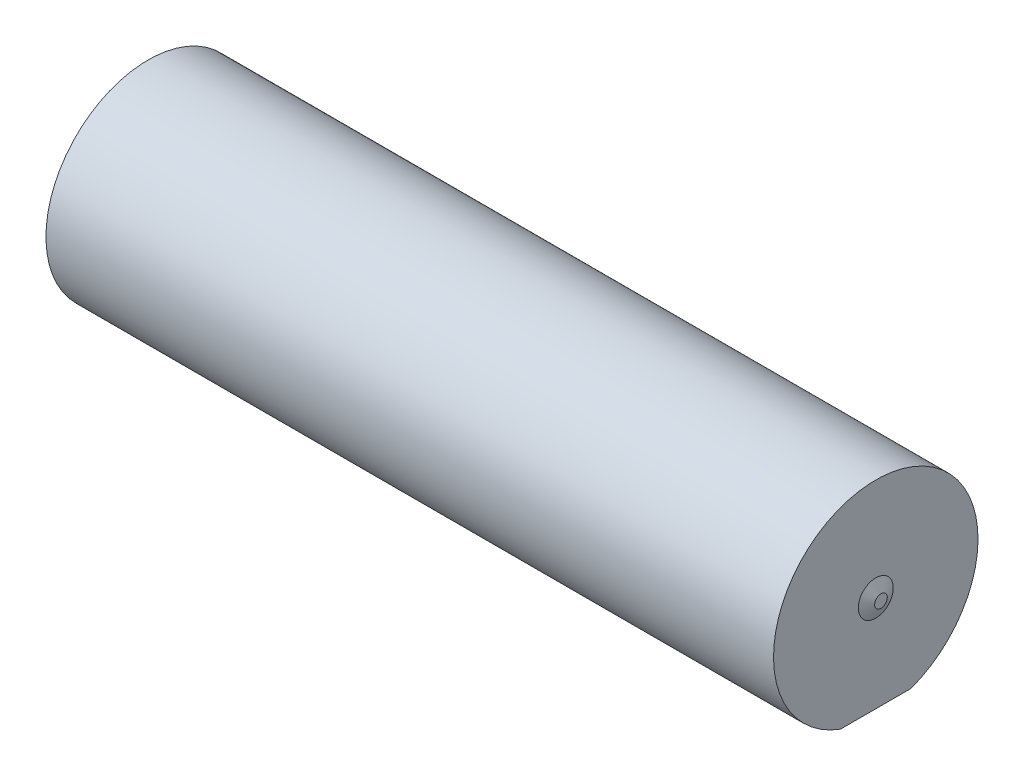
ISO-10303-21;
HEADER;
FILE_DESCRIPTION(('STEP AP214'),'2;1');
FILE_NAME('part.step','',(''),(''),'','','');
FILE_SCHEMA(('AUTOMOTIVE_DESIGN { 1 0 10303 214 1 1 1 1 }'));
ENDSEC;
DATA;
#1=APPLICATION_CONTEXT('core data for automotive mechanical design processes');
#2=APPLICATION_PROTOCOL_DEFINITION('international standard','automotive_design',2000,#1);
#3=PRODUCT_CONTEXT('',#1,'mechanical');
#4=PRODUCT('Part','Part','',(#3));
#5=PRODUCT_RELATED_PRODUCT_CATEGORY('part','',(#4));
#6=PRODUCT_DEFINITION_FORMATION('','',#4);
#7=PRODUCT_DEFINITION_CONTEXT('part definition',#1,'design');
#8=PRODUCT_DEFINITION('design','',#6,#7);
#9=PRODUCT_DEFINITION_SHAPE('','',#8);
#10=(LENGTH_UNIT() NAMED_UNIT(*) SI_UNIT(.MILLI.,.METRE.));
#11=(NAMED_UNIT(*) PLANE_ANGLE_UNIT() SI_UNIT($,.RADIAN.));
#12=(NAMED_UNIT(*) SI_UNIT($,.STERADIAN.) SOLID_ANGLE_UNIT());
#13=UNCERTAINTY_MEASURE_WITH_UNIT(LENGTH_MEASURE(1.E-05),#10,'distance_accuracy_value','');
#14=(GEOMETRIC_REPRESENTATION_CONTEXT(3) GLOBAL_UNCERTAINTY_ASSIGNED_CONTEXT((#13)) GLOBAL_UNIT_ASSIGNED_CONTEXT((#10,
#11,#12)) REPRESENTATION_CONTEXT('',''));
#15=CARTESIAN_POINT('',(0.,0.,0.));
#16=DIRECTION('',(0.,0.,1.));
#17=DIRECTION('',(1.,0.,0.));
#18=AXIS2_PLACEMENT_3D('',#15,#16,#17);
#19=CARTESIAN_POINT('',(0.,0.,0.));
#20=DIRECTION('',(-1.,0.,0.));
#21=DIRECTION('',(0.,-1.,0.));
#22=AXIS2_PLACEMENT_3D('',#19,#20,#21);
#23=CYLINDRICAL_SURFACE('',#22,196.645479285607);
#24=CARTESIAN_POINT('',(0.,0.,0.));
#25=DIRECTION('',(-1.,0.,0.));
#26=DIRECTION('',(0.,-1.,0.));
#27=AXIS2_PLACEMENT_3D('',#24,#25,#26);
#28=CIRCLE('',#27,196.645479285607);
#29=CARTESIAN_POINT('',(0.,-196.645479285607,0.));
#30=VERTEX_POINT('',#29);
#31=EDGE_CURVE('E123',#30,#30,#28,.T.);
#32=ORIENTED_EDGE('',*,*,#31,.F.);
#33=EDGE_LOOP('',(#32));
#34=FACE_BOUND('',#33,.T.);
#35=DIRECTION('',(-1.,0.,0.));
#36=VECTOR('',#35,1.);
#37=CARTESIAN_POINT('',(0.,-184.594850552424,67.7804224905273));
#38=LINE('',#37,#36);
#39=CARTESIAN_POINT('',(1399.31947366069,-184.594850552424,67.7804224905269));
#40=VERTEX_POINT('',#39);
#41=CARTESIAN_POINT('',(1000.,-184.594850552424,67.7804224905271));
#42=VERTEX_POINT('',#41);
#43=EDGE_CURVE('E93',#40,#42,#38,.T.);
#44=ORIENTED_EDGE('',*,*,#43,.F.);
#45=CARTESIAN_POINT('',(1399.31947366069,1.13312312440551E-13,0.));
#46=DIRECTION('',(-1.,0.,0.));
#47=DIRECTION('',(0.,-1.,0.));
#48=AXIS2_PLACEMENT_3D('',#45,#46,#47);
#49=CIRCLE('',#48,196.645479285607);
#50=CARTESIAN_POINT('',(1399.31947366069,-184.594850552424,-67.7804224905269));
#51=VERTEX_POINT('',#50);
#52=EDGE_CURVE('E92',#40,#51,#49,.T.);
#53=ORIENTED_EDGE('',*,*,#52,.T.);
#54=DIRECTION('',(-1.,0.,0.));
#55=VECTOR('',#54,1.);
#56=CARTESIAN_POINT('',(0.,-184.594850552424,-67.7804224905273));
#57=LINE('',#56,#55);
#58=CARTESIAN_POINT('',(1000.,-184.594850552424,-67.7804224905271));
#59=VERTEX_POINT('',#58);
#60=EDGE_CURVE('E85',#59,#51,#57,.F.);
#61=ORIENTED_EDGE('',*,*,#60,.F.);
#62=CARTESIAN_POINT('',(1000.,0.,0.));
#63=DIRECTION('',(-1.,0.,0.));
#64=DIRECTION('',(0.,0.,1.));
#65=AXIS2_PLACEMENT_3D('',#62,#63,#64);
#66=CIRCLE('',#65,196.645479285607);
#67=EDGE_CURVE('E43',#59,#42,#66,.T.);
#68=ORIENTED_EDGE('',*,*,#67,.T.);
#69=EDGE_LOOP('',(#44,#53,#61,#68));
#70=FACE_BOUND('',#69,.T.);
#71=ADVANCED_FACE('F35',(#34,#70),#23,.T.);
#72=CARTESIAN_POINT('',(1399.31947366069,196.645479285607,0.));
#73=DIRECTION('',(-1.,0.,0.));
#74=DIRECTION('',(0.,-1.,0.));
#75=AXIS2_PLACEMENT_3D('',#72,#73,#74);
#76=PLANE('',#75);
#77=CARTESIAN_POINT('',(1399.31947366069,1.13312312440551E-13,0.));
#78=DIRECTION('',(-1.,0.,0.));
#79=DIRECTION('',(0.,-1.,0.));
#80=AXIS2_PLACEMENT_3D('',#77,#78,#79);
#81=CIRCLE('',#80,33.57963809691);
#82=CARTESIAN_POINT('',(1399.31947366069,-33.5796380969099,0.));
#83=VERTEX_POINT('',#82);
#84=EDGE_CURVE('E83',#83,#83,#81,.F.);
#85=ORIENTED_EDGE('',*,*,#84,.F.);
#86=EDGE_LOOP('',(#85));
#87=FACE_BOUND('',#86,.T.);
#88=DIRECTION('',(0.,0.,1.));
#89=VECTOR('',#88,1.);
#90=CARTESIAN_POINT('',(1399.31947366069,-184.594850552424,0.));
#91=LINE('',#90,#89);
#92=EDGE_CURVE('E56',#51,#40,#91,.T.);
#93=ORIENTED_EDGE('',*,*,#92,.F.);
#94=ORIENTED_EDGE('',*,*,#52,.F.);
#95=EDGE_LOOP('',(#93,#94));
#96=FACE_BOUND('',#95,.T.);
#97=ADVANCED_FACE('F135',(#87,#96),#76,.F.);
#98=CARTESIAN_POINT('',(0.,0.,0.));
#99=DIRECTION('',(-1.,0.,0.));
#100=DIRECTION('',(0.,-1.,0.));
#101=AXIS2_PLACEMENT_3D('',#98,#99,#100);
#102=CYLINDRICAL_SURFACE('',#101,186.645479285607);
#103=CARTESIAN_POINT('',(0.,0.,0.));
#104=DIRECTION('',(1.,0.,0.));
#105=DIRECTION('',(0.,1.,0.));
#106=AXIS2_PLACEMENT_3D('',#103,#104,#105);
#107=CIRCLE('',#106,186.645479285607);
#108=CARTESIAN_POINT('',(0.,186.645479285607,0.));
#109=VERTEX_POINT('',#108);
#110=EDGE_CURVE('E116',#109,#109,#107,.F.);
#111=ORIENTED_EDGE('',*,*,#110,.T.);
#112=EDGE_LOOP('',(#111));
#113=FACE_BOUND('',#112,.T.);
#114=CARTESIAN_POINT('',(1389.31947366069,1.12502545160288E-13,0.));
#115=DIRECTION('',(-1.,0.,0.));
#116=DIRECTION('',(0.,-1.,0.));
#117=AXIS2_PLACEMENT_3D('',#114,#115,#116);
#118=CIRCLE('',#117,186.645479285607);
#119=CARTESIAN_POINT('',(1389.31947366069,-184.594850552424,27.5912320725656));
#120=VERTEX_POINT('',#119);
#121=CARTESIAN_POINT('',(1389.31947366069,-184.594850552424,-27.5912320725656));
#122=VERTEX_POINT('',#121);
#123=EDGE_CURVE('E105',#120,#122,#118,.T.);
#124=ORIENTED_EDGE('',*,*,#123,.F.);
#125=DIRECTION('',(-1.,0.,0.));
#126=VECTOR('',#125,1.);
#127=CARTESIAN_POINT('',(0.,-184.594850552424,27.5912320725667));
#128=LINE('',#127,#126);
#129=CARTESIAN_POINT('',(1000.,-184.594850552424,27.5912320725662));
#130=VERTEX_POINT('',#129);
#131=EDGE_CURVE('E50',#120,#130,#128,.T.);
#132=ORIENTED_EDGE('',*,*,#131,.T.);
#133=CARTESIAN_POINT('',(1000.,0.,0.));
#134=DIRECTION('',(1.,0.,0.));
#135=DIRECTION('',(0.,0.,-1.));
#136=AXIS2_PLACEMENT_3D('',#133,#134,#135);
#137=CIRCLE('',#136,186.645479285607);
#138=CARTESIAN_POINT('',(1000.,-184.594850552424,-27.5912320725662));
#139=VERTEX_POINT('',#138);
#140=EDGE_CURVE('E88',#130,#139,#137,.T.);
#141=ORIENTED_EDGE('',*,*,#140,.T.);
#142=DIRECTION('',(-1.,0.,0.));
#143=VECTOR('',#142,1.);
#144=CARTESIAN_POINT('',(0.,-184.594850552424,-27.5912320725667));
#145=LINE('',#144,#143);
#146=EDGE_CURVE('E87',#139,#122,#145,.F.);
#147=ORIENTED_EDGE('',*,*,#146,.T.);
#148=EDGE_LOOP('',(#124,#132,#141,#147));
#149=FACE_BOUND('',#148,.T.);
#150=ADVANCED_FACE('F138',(#113,#149),#102,.F.);
#151=CARTESIAN_POINT('',(1389.31947366069,26.0597886929293,0.));
#152=DIRECTION('',(-1.,0.,0.));
#153=DIRECTION('',(0.,-1.,0.));
#154=AXIS2_PLACEMENT_3D('',#151,#152,#153);
#155=PLANE('',#154);
#156=CARTESIAN_POINT('',(1389.31947366069,1.12502545160288E-13,0.));
#157=DIRECTION('',(-1.,0.,0.));
#158=DIRECTION('',(0.,-1.,0.));
#159=AXIS2_PLACEMENT_3D('',#156,#157,#158);
#160=CIRCLE('',#159,26.0597886929292);
#161=CARTESIAN_POINT('',(1389.31947366069,-26.0597886929291,0.));
#162=VERTEX_POINT('',#161);
#163=EDGE_CURVE('E108',#162,#162,#160,.T.);
#164=ORIENTED_EDGE('',*,*,#163,.F.);
#165=EDGE_LOOP('',(#164));
#166=FACE_BOUND('',#165,.T.);
#167=ORIENTED_EDGE('',*,*,#123,.T.);
#168=DIRECTION('',(0.,0.,1.));
#169=VECTOR('',#168,1.);
#170=CARTESIAN_POINT('',(1389.31947366069,-184.594850552424,0.));
#171=LINE('',#170,#169);
#172=EDGE_CURVE('E11',#122,#120,#171,.T.);
#173=ORIENTED_EDGE('',*,*,#172,.T.);
#174=EDGE_LOOP('',(#167,#173));
#175=FACE_BOUND('',#174,.T.);
#176=ADVANCED_FACE('F144',(#166,#175),#155,.T.);
#177=CARTESIAN_POINT('',(0.,160.,0.));
#178=DIRECTION('',(1.,0.,0.));
#179=DIRECTION('',(0.,1.,0.));
#180=AXIS2_PLACEMENT_3D('',#177,#178,#179);
#181=PLANE('',#180);
#182=ORIENTED_EDGE('',*,*,#31,.T.);
#183=EDGE_LOOP('',(#182));
#184=FACE_BOUND('',#183,.T.);
#185=ORIENTED_EDGE('',*,*,#110,.F.);
#186=EDGE_LOOP('',(#185));
#187=FACE_BOUND('',#186,.T.);
#188=ADVANCED_FACE('F37',(#184,#187),#181,.F.);
#189=CARTESIAN_POINT('',(0.,0.,0.));
#190=DIRECTION('',(-1.,0.,0.));
#191=DIRECTION('',(0.,-1.,0.));
#192=AXIS2_PLACEMENT_3D('',#189,#190,#191);
#193=CIRCLE('',#192,160.);
#194=CARTESIAN_POINT('',(0.,-160.,0.));
#195=VERTEX_POINT('',#194);
#196=EDGE_CURVE('E112',#195,#195,#193,.T.);
#197=ORIENTED_EDGE('',*,*,#196,.F.);
#198=EDGE_LOOP('',(#197));
#199=FACE_BOUND('',#198,.T.);
#200=CARTESIAN_POINT('',(0.,0.,0.));
#201=DIRECTION('',(1.,0.,0.));
#202=DIRECTION('',(0.,1.,0.));
#203=AXIS2_PLACEMENT_3D('',#200,#201,#202);
#204=CIRCLE('',#203,170.);
#205=CARTESIAN_POINT('',(0.,170.,0.));
#206=VERTEX_POINT('',#205);
#207=EDGE_CURVE('E111',#206,#206,#204,.T.);
#208=ORIENTED_EDGE('',*,*,#207,.F.);
#209=EDGE_LOOP('',(#208));
#210=FACE_BOUND('',#209,.T.);
#211=ADVANCED_FACE('F153',(#199,#210),#181,.F.);
#212=CARTESIAN_POINT('',(800.,0.,0.));
#213=DIRECTION('',(-1.,0.,0.));
#214=DIRECTION('',(0.,-1.,0.));
#215=AXIS2_PLACEMENT_3D('',#212,#213,#214);
#216=DEGENERATE_TOROIDAL_SURFACE('',#215,1108.36489583073,1268.36489583073,.F.);
#217=CARTESIAN_POINT('',(1399.31947366069,1.13312312440551E-13,0.));
#218=DIRECTION('',(-1.,0.,0.));
#219=DIRECTION('',(0.,-1.,0.));
#220=AXIS2_PLACEMENT_3D('',#217,#218,#219);
#221=CIRCLE('',#220,9.47484110242047);
#222=CARTESIAN_POINT('',(1399.31947366069,-9.47484110242036,0.));
#223=VERTEX_POINT('',#222);
#224=EDGE_CURVE('E119',#223,#223,#221,.T.);
#225=ORIENTED_EDGE('',*,*,#224,.F.);
#226=EDGE_LOOP('',(#225));
#227=FACE_BOUND('',#226,.T.);
#228=CARTESIAN_POINT('',(800.,0.,0.));
#229=DIRECTION('',(-1.,0.,0.));
#230=DIRECTION('',(0.,-1.,0.));
#231=AXIS2_PLACEMENT_3D('',#228,#229,#230);
#232=CIRCLE('',#231,160.);
#233=CARTESIAN_POINT('',(800.,-160.,0.));
#234=VERTEX_POINT('',#233);
#235=EDGE_CURVE('E115',#234,#234,#232,.T.);
#236=ORIENTED_EDGE('',*,*,#235,.T.);
#237=EDGE_LOOP('',(#236));
#238=FACE_BOUND('',#237,.T.);
#239=ADVANCED_FACE('F149',(#227,#238),#216,.T.);
#240=CARTESIAN_POINT('',(0.,0.,0.));
#241=DIRECTION('',(-1.,0.,0.));
#242=DIRECTION('',(0.,-1.,0.));
#243=AXIS2_PLACEMENT_3D('',#240,#241,#242);
#244=CYLINDRICAL_SURFACE('',#243,160.);
#245=ORIENTED_EDGE('',*,*,#235,.F.);
#246=EDGE_LOOP('',(#245));
#247=FACE_BOUND('',#246,.T.);
#248=ORIENTED_EDGE('',*,*,#196,.T.);
#249=EDGE_LOOP('',(#248));
#250=FACE_BOUND('',#249,.T.);
#251=ADVANCED_FACE('F152',(#247,#250),#244,.F.);
#252=CARTESIAN_POINT('',(0.,0.,0.));
#253=DIRECTION('',(-1.,0.,0.));
#254=DIRECTION('',(0.,-1.,0.));
#255=AXIS2_PLACEMENT_3D('',#252,#253,#254);
#256=CYLINDRICAL_SURFACE('',#255,170.);
#257=CARTESIAN_POINT('',(800.,0.,0.));
#258=DIRECTION('',(-1.,0.,0.));
#259=DIRECTION('',(0.,-1.,0.));
#260=AXIS2_PLACEMENT_3D('',#257,#258,#259);
#261=CIRCLE('',#260,170.);
#262=CARTESIAN_POINT('',(800.,-170.,0.));
#263=VERTEX_POINT('',#262);
#264=EDGE_CURVE('E102',#263,#263,#261,.T.);
#265=ORIENTED_EDGE('',*,*,#264,.T.);
#266=EDGE_LOOP('',(#265));
#267=FACE_BOUND('',#266,.T.);
#268=ORIENTED_EDGE('',*,*,#207,.T.);
#269=EDGE_LOOP('',(#268));
#270=FACE_BOUND('',#269,.T.);
#271=ADVANCED_FACE('F157',(#267,#270),#256,.T.);
#272=CARTESIAN_POINT('',(800.,0.,0.));
#273=DIRECTION('',(-1.,0.,0.));
#274=DIRECTION('',(0.,-1.,0.));
#275=AXIS2_PLACEMENT_3D('',#272,#273,#274);
#276=DEGENERATE_TOROIDAL_SURFACE('',#275,1108.36489583073,1278.36489583073,.F.);
#277=ORIENTED_EDGE('',*,*,#163,.T.);
#278=EDGE_LOOP('',(#277));
#279=FACE_BOUND('',#278,.T.);
#280=ORIENTED_EDGE('',*,*,#264,.F.);
#281=EDGE_LOOP('',(#280));
#282=FACE_BOUND('',#281,.T.);
#283=ADVANCED_FACE('F159',(#279,#282),#276,.F.);
#284=CARTESIAN_POINT('',(1399.31947366069,1.13312312440551E-13,0.));
#285=DIRECTION('',(1.,0.,0.));
#286=DIRECTION('',(0.,1.,0.));
#287=AXIS2_PLACEMENT_3D('',#284,#285,#286);
#288=PLANE('',#287);
#289=ORIENTED_EDGE('',*,*,#224,.T.);
#290=EDGE_LOOP('',(#289));
#291=FACE_BOUND('',#290,.T.);
#292=ADVANCED_FACE('F162',(#291),#288,.F.);
#293=CARTESIAN_POINT('',(1399.31947366069,1.13312312440551E-13,0.));
#294=DIRECTION('',(-1.,0.,0.));
#295=DIRECTION('',(0.,1.,0.));
#296=AXIS2_PLACEMENT_3D('',#293,#294,#295);
#297=CONICAL_SURFACE('',#296,33.57963809691,1.13446401379632);
#298=CARTESIAN_POINT('',(1409.31947366069,1.14122079720814E-13,0.));
#299=DIRECTION('',(1.,0.,0.));
#300=DIRECTION('',(0.,1.,0.));
#301=AXIS2_PLACEMENT_3D('',#298,#299,#300);
#302=CIRCLE('',#301,12.1345688918143);
#303=CARTESIAN_POINT('',(1409.31947366069,12.1345688918144,0.));
#304=VERTEX_POINT('',#303);
#305=EDGE_CURVE('E95',#304,#304,#302,.T.);
#306=ORIENTED_EDGE('',*,*,#305,.F.);
#307=EDGE_LOOP('',(#306));
#308=FACE_BOUND('',#307,.T.);
#309=ORIENTED_EDGE('',*,*,#84,.T.);
#310=EDGE_LOOP('',(#309));
#311=FACE_BOUND('',#310,.T.);
#312=ADVANCED_FACE('F133',(#308,#311),#297,.T.);
#313=CARTESIAN_POINT('',(1409.31947366069,1.14122079720814E-13,0.));
#314=DIRECTION('',(1.,0.,0.));
#315=DIRECTION('',(0.,1.,0.));
#316=AXIS2_PLACEMENT_3D('',#313,#314,#315);
#317=PLANE('',#316);
#318=ORIENTED_EDGE('',*,*,#305,.T.);
#319=EDGE_LOOP('',(#318));
#320=FACE_BOUND('',#319,.T.);
#321=ADVANCED_FACE('F172',(#320),#317,.T.);
#322=CARTESIAN_POINT('',(1000.,0.,0.));
#323=DIRECTION('',(-1.,0.,0.));
#324=DIRECTION('',(0.,0.,1.));
#325=AXIS2_PLACEMENT_3D('',#322,#323,#324);
#326=PLANE('',#325);
#327=ORIENTED_EDGE('',*,*,#67,.F.);
#328=DIRECTION('',(0.,0.,1.));
#329=VECTOR('',#328,1.);
#330=CARTESIAN_POINT('',(1000.,-184.594850552424,78.2432463469922));
#331=LINE('',#330,#329);
#332=EDGE_CURVE('E78',#59,#139,#331,.T.);
#333=ORIENTED_EDGE('',*,*,#332,.T.);
#334=ORIENTED_EDGE('',*,*,#140,.F.);
#335=EDGE_CURVE('E80',#130,#42,#331,.T.);
#336=ORIENTED_EDGE('',*,*,#335,.T.);
#337=EDGE_LOOP('',(#327,#333,#334,#336));
#338=FACE_BOUND('',#337,.T.);
#339=ADVANCED_FACE('F77',(#338),#326,.F.);
#340=CARTESIAN_POINT('',(1729.,-184.594850552424,78.2432463469922));
#341=DIRECTION('',(0.,-1.,0.));
#342=DIRECTION('',(0.,0.,-1.));
#343=AXIS2_PLACEMENT_3D('',#340,#341,#342);
#344=PLANE('',#343);
#345=ORIENTED_EDGE('',*,*,#43,.T.);
#346=ORIENTED_EDGE('',*,*,#335,.F.);
#347=ORIENTED_EDGE('',*,*,#131,.F.);
#348=ORIENTED_EDGE('',*,*,#172,.F.);
#349=ORIENTED_EDGE('',*,*,#146,.F.);
#350=ORIENTED_EDGE('',*,*,#332,.F.);
#351=ORIENTED_EDGE('',*,*,#60,.T.);
#352=ORIENTED_EDGE('',*,*,#92,.T.);
#353=EDGE_LOOP('',(#345,#346,#347,#348,#349,#350,#351,#352));
#354=FACE_BOUND('',#353,.T.);
#355=ADVANCED_FACE('F84',(#354),#344,.T.);
#356=CLOSED_SHELL('',(#71,#97,#150,#176,#188,#211,#239,#251,#271,#283,#292,#312,#321,#339,#355));
#357=MANIFOLD_SOLID_BREP('B2',#356);
#358=ADVANCED_BREP_SHAPE_REPRESENTATION('',(#18,#357),#14);
#359=SHAPE_DEFINITION_REPRESENTATION(#9,#358);
ENDSEC;
END-ISO-10303-21;
